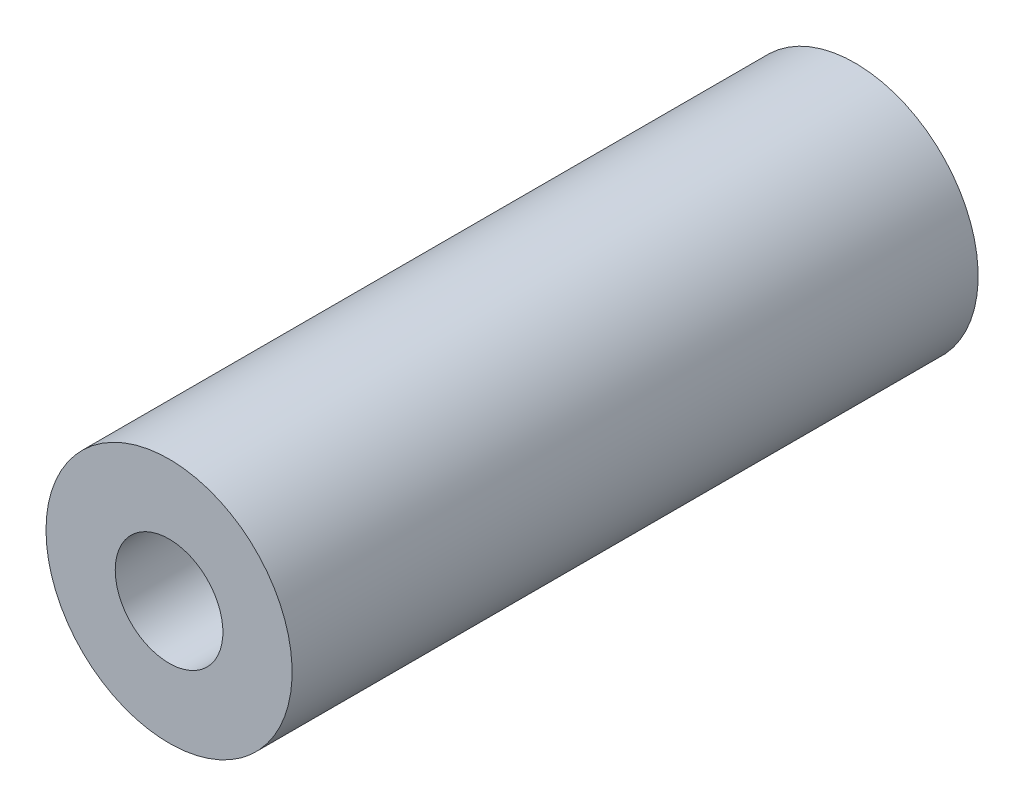
ISO-10303-21;
HEADER;
FILE_DESCRIPTION(('STEP AP214'),'2;1');
FILE_NAME('part.step','',(''),(''),'','','');
FILE_SCHEMA(('AUTOMOTIVE_DESIGN { 1 0 10303 214 1 1 1 1 }'));
ENDSEC;
DATA;
#1=APPLICATION_CONTEXT('core data for automotive mechanical design processes');
#2=APPLICATION_PROTOCOL_DEFINITION('international standard','automotive_design',2000,#1);
#3=PRODUCT_CONTEXT('',#1,'mechanical');
#4=PRODUCT('Part','Part','',(#3));
#5=PRODUCT_RELATED_PRODUCT_CATEGORY('part','',(#4));
#6=PRODUCT_DEFINITION_FORMATION('','',#4);
#7=PRODUCT_DEFINITION_CONTEXT('part definition',#1,'design');
#8=PRODUCT_DEFINITION('design','',#6,#7);
#9=PRODUCT_DEFINITION_SHAPE('','',#8);
#10=(LENGTH_UNIT() NAMED_UNIT(*) SI_UNIT(.MILLI.,.METRE.));
#11=(NAMED_UNIT(*) PLANE_ANGLE_UNIT() SI_UNIT($,.RADIAN.));
#12=(NAMED_UNIT(*) SI_UNIT($,.STERADIAN.) SOLID_ANGLE_UNIT());
#13=UNCERTAINTY_MEASURE_WITH_UNIT(LENGTH_MEASURE(1.E-05),#10,'distance_accuracy_value','');
#14=(GEOMETRIC_REPRESENTATION_CONTEXT(3) GLOBAL_UNCERTAINTY_ASSIGNED_CONTEXT((#13)) GLOBAL_UNIT_ASSIGNED_CONTEXT((#10,
#11,#12)) REPRESENTATION_CONTEXT('',''));
#15=CARTESIAN_POINT('',(0.,0.,0.));
#16=DIRECTION('',(0.,0.,1.));
#17=DIRECTION('',(1.,0.,0.));
#18=AXIS2_PLACEMENT_3D('',#15,#16,#17);
#19=CARTESIAN_POINT('',(-5.8,24.4,-9.80000000000001));
#20=DIRECTION('',(0.,0.,-1.));
#21=DIRECTION('',(-1.,0.,0.));
#22=AXIS2_PLACEMENT_3D('',#19,#20,#21);
#23=PLANE('',#22);
#24=CARTESIAN_POINT('',(-5.8,24.4,-9.80000000000001));
#25=DIRECTION('',(0.,0.,-1.));
#26=DIRECTION('',(-1.,0.,0.));
#27=AXIS2_PLACEMENT_3D('',#24,#25,#26);
#28=CIRCLE('',#27,4.);
#29=CARTESIAN_POINT('',(-9.8,24.4,-9.80000000000001));
#30=VERTEX_POINT('',#29);
#31=EDGE_CURVE('E10',#30,#30,#28,.T.);
#32=ORIENTED_EDGE('',*,*,#31,.T.);
#33=EDGE_LOOP('',(#32));
#34=FACE_BOUND('',#33,.T.);
#35=CARTESIAN_POINT('',(-5.8,24.4,-9.80000000000001));
#36=DIRECTION('',(0.,0.,-1.));
#37=DIRECTION('',(-1.,0.,0.));
#38=AXIS2_PLACEMENT_3D('',#35,#36,#37);
#39=CIRCLE('',#38,1.75);
#40=CARTESIAN_POINT('',(-7.55,24.4,-9.80000000000001));
#41=VERTEX_POINT('',#40);
#42=EDGE_CURVE('E44',#41,#41,#39,.T.);
#43=ORIENTED_EDGE('',*,*,#42,.F.);
#44=EDGE_LOOP('',(#43));
#45=FACE_BOUND('',#44,.T.);
#46=ADVANCED_FACE('F33',(#34,#45),#23,.T.);
#47=CARTESIAN_POINT('',(-5.8,24.4,12.5));
#48=DIRECTION('',(0.,0.,-1.));
#49=DIRECTION('',(-1.,0.,0.));
#50=AXIS2_PLACEMENT_3D('',#47,#48,#49);
#51=PLANE('',#50);
#52=CARTESIAN_POINT('',(-5.8,24.4,12.5));
#53=DIRECTION('',(0.,0.,-1.));
#54=DIRECTION('',(-1.,0.,0.));
#55=AXIS2_PLACEMENT_3D('',#52,#53,#54);
#56=CIRCLE('',#55,4.);
#57=CARTESIAN_POINT('',(-9.8,24.4,12.5));
#58=VERTEX_POINT('',#57);
#59=EDGE_CURVE('E37',#58,#58,#56,.T.);
#60=ORIENTED_EDGE('',*,*,#59,.F.);
#61=EDGE_LOOP('',(#60));
#62=FACE_BOUND('',#61,.T.);
#63=CARTESIAN_POINT('',(-5.8,24.4,12.5));
#64=DIRECTION('',(0.,0.,-1.));
#65=DIRECTION('',(-1.,0.,0.));
#66=AXIS2_PLACEMENT_3D('',#63,#64,#65);
#67=CIRCLE('',#66,1.75);
#68=CARTESIAN_POINT('',(-7.55,24.4,12.5));
#69=VERTEX_POINT('',#68);
#70=EDGE_CURVE('E46',#69,#69,#67,.T.);
#71=ORIENTED_EDGE('',*,*,#70,.T.);
#72=EDGE_LOOP('',(#71));
#73=FACE_BOUND('',#72,.T.);
#74=ADVANCED_FACE('F56',(#62,#73),#51,.F.);
#75=CARTESIAN_POINT('',(-5.8,24.4,-9.80000000000001));
#76=DIRECTION('',(0.,0.,1.));
#77=DIRECTION('',(1.,0.,0.));
#78=AXIS2_PLACEMENT_3D('',#75,#76,#77);
#79=CYLINDRICAL_SURFACE('',#78,4.);
#80=ORIENTED_EDGE('',*,*,#31,.F.);
#81=EDGE_LOOP('',(#80));
#82=FACE_BOUND('',#81,.T.);
#83=ORIENTED_EDGE('',*,*,#59,.T.);
#84=EDGE_LOOP('',(#83));
#85=FACE_BOUND('',#84,.T.);
#86=ADVANCED_FACE('F35',(#82,#85),#79,.T.);
#87=CARTESIAN_POINT('',(-5.8,24.4,-9.80000000000001));
#88=DIRECTION('',(0.,0.,1.));
#89=DIRECTION('',(1.,0.,0.));
#90=AXIS2_PLACEMENT_3D('',#87,#88,#89);
#91=CYLINDRICAL_SURFACE('',#90,1.75);
#92=ORIENTED_EDGE('',*,*,#42,.T.);
#93=EDGE_LOOP('',(#92));
#94=FACE_BOUND('',#93,.T.);
#95=ORIENTED_EDGE('',*,*,#70,.F.);
#96=EDGE_LOOP('',(#95));
#97=FACE_BOUND('',#96,.T.);
#98=ADVANCED_FACE('F52',(#94,#97),#91,.F.);
#99=CLOSED_SHELL('',(#46,#74,#86,#98));
#100=MANIFOLD_SOLID_BREP('B2',#99);
#101=ADVANCED_BREP_SHAPE_REPRESENTATION('',(#18,#100),#14);
#102=SHAPE_DEFINITION_REPRESENTATION(#9,#101);
ENDSEC;
END-ISO-10303-21;
